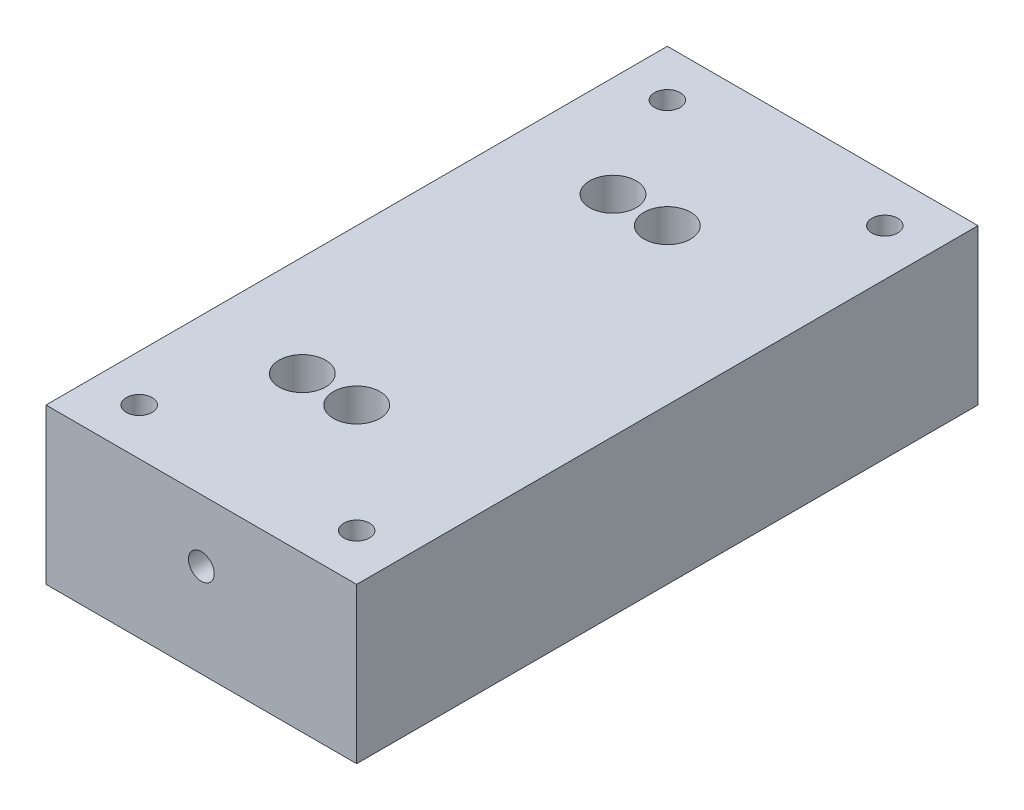
ISO-10303-21;
HEADER;
FILE_DESCRIPTION(('STEP AP214'),'2;1');
FILE_NAME('part.step','',(''),(''),'','','');
FILE_SCHEMA(('AUTOMOTIVE_DESIGN { 1 0 10303 214 1 1 1 1 }'));
ENDSEC;
DATA;
#1=APPLICATION_CONTEXT('core data for automotive mechanical design processes');
#2=APPLICATION_PROTOCOL_DEFINITION('international standard','automotive_design',2000,#1);
#3=PRODUCT_CONTEXT('',#1,'mechanical');
#4=PRODUCT('Part','Part','',(#3));
#5=PRODUCT_RELATED_PRODUCT_CATEGORY('part','',(#4));
#6=PRODUCT_DEFINITION_FORMATION('','',#4);
#7=PRODUCT_DEFINITION_CONTEXT('part definition',#1,'design');
#8=PRODUCT_DEFINITION('design','',#6,#7);
#9=PRODUCT_DEFINITION_SHAPE('','',#8);
#10=(LENGTH_UNIT() NAMED_UNIT(*) SI_UNIT(.MILLI.,.METRE.));
#11=(NAMED_UNIT(*) PLANE_ANGLE_UNIT() SI_UNIT($,.RADIAN.));
#12=(NAMED_UNIT(*) SI_UNIT($,.STERADIAN.) SOLID_ANGLE_UNIT());
#13=UNCERTAINTY_MEASURE_WITH_UNIT(LENGTH_MEASURE(1.E-05),#10,'distance_accuracy_value','');
#14=(GEOMETRIC_REPRESENTATION_CONTEXT(3) GLOBAL_UNCERTAINTY_ASSIGNED_CONTEXT((#13)) GLOBAL_UNIT_ASSIGNED_CONTEXT((#10,
#11,#12)) REPRESENTATION_CONTEXT('',''));
#15=CARTESIAN_POINT('',(0.,0.,0.));
#16=DIRECTION('',(0.,0.,1.));
#17=DIRECTION('',(1.,0.,0.));
#18=AXIS2_PLACEMENT_3D('',#15,#16,#17);
#19=CARTESIAN_POINT('',(50.,-25.,200.));
#20=DIRECTION('',(0.,-1.,0.));
#21=DIRECTION('',(1.,0.,0.));
#22=AXIS2_PLACEMENT_3D('',#19,#20,#21);
#23=PLANE('',#22);
#24=CARTESIAN_POINT('',(-17.5,-25.,50.));
#25=DIRECTION('',(0.,-1.,0.));
#26=DIRECTION('',(0.,0.,-1.));
#27=AXIS2_PLACEMENT_3D('',#24,#25,#26);
#28=CIRCLE('',#27,7.5);
#29=CARTESIAN_POINT('',(-17.5,-25.,42.5));
#30=VERTEX_POINT('',#29);
#31=EDGE_CURVE('E132',#30,#30,#28,.T.);
#32=ORIENTED_EDGE('',*,*,#31,.F.);
#33=EDGE_LOOP('',(#32));
#34=FACE_BOUND('',#33,.T.);
#35=CARTESIAN_POINT('',(-17.5,-25.,150.));
#36=DIRECTION('',(0.,-1.,0.));
#37=DIRECTION('',(0.,0.,-1.));
#38=AXIS2_PLACEMENT_3D('',#35,#36,#37);
#39=CIRCLE('',#38,7.5);
#40=CARTESIAN_POINT('',(-17.5,-25.,142.5));
#41=VERTEX_POINT('',#40);
#42=EDGE_CURVE('E150',#41,#41,#39,.T.);
#43=ORIENTED_EDGE('',*,*,#42,.F.);
#44=EDGE_LOOP('',(#43));
#45=FACE_BOUND('',#44,.T.);
#46=CARTESIAN_POINT('',(0.,-25.,50.));
#47=DIRECTION('',(0.,-1.,0.));
#48=DIRECTION('',(0.,0.,-1.));
#49=AXIS2_PLACEMENT_3D('',#46,#47,#48);
#50=CIRCLE('',#49,7.5);
#51=CARTESIAN_POINT('',(0.,-25.,42.5));
#52=VERTEX_POINT('',#51);
#53=EDGE_CURVE('E195',#52,#52,#50,.T.);
#54=ORIENTED_EDGE('',*,*,#53,.F.);
#55=EDGE_LOOP('',(#54));
#56=FACE_BOUND('',#55,.T.);
#57=CARTESIAN_POINT('',(0.,-25.,150.));
#58=DIRECTION('',(0.,-1.,0.));
#59=DIRECTION('',(0.,0.,-1.));
#60=AXIS2_PLACEMENT_3D('',#57,#58,#59);
#61=CIRCLE('',#60,7.5);
#62=CARTESIAN_POINT('',(0.,-25.,142.5));
#63=VERTEX_POINT('',#62);
#64=EDGE_CURVE('E213',#63,#63,#61,.T.);
#65=ORIENTED_EDGE('',*,*,#64,.F.);
#66=EDGE_LOOP('',(#65));
#67=FACE_BOUND('',#66,.T.);
#68=DIRECTION('',(-1.,0.,0.));
#69=VECTOR('',#68,1.);
#70=CARTESIAN_POINT('',(50.,-25.,0.));
#71=LINE('',#70,#69);
#72=CARTESIAN_POINT('',(50.,-25.,0.));
#73=VERTEX_POINT('',#72);
#74=CARTESIAN_POINT('',(-50.,-25.,0.));
#75=VERTEX_POINT('',#74);
#76=EDGE_CURVE('E231',#73,#75,#71,.T.);
#77=ORIENTED_EDGE('',*,*,#76,.F.);
#78=DIRECTION('',(0.,0.,-1.));
#79=VECTOR('',#78,1.);
#80=CARTESIAN_POINT('',(50.,-25.,200.));
#81=LINE('',#80,#79);
#82=CARTESIAN_POINT('',(50.,-25.,200.));
#83=VERTEX_POINT('',#82);
#84=EDGE_CURVE('E11',#83,#73,#81,.T.);
#85=ORIENTED_EDGE('',*,*,#84,.F.);
#86=DIRECTION('',(-1.,0.,0.));
#87=VECTOR('',#86,1.);
#88=CARTESIAN_POINT('',(50.,-25.,200.));
#89=LINE('',#88,#87);
#90=CARTESIAN_POINT('',(-50.,-25.,200.));
#91=VERTEX_POINT('',#90);
#92=EDGE_CURVE('E232',#83,#91,#89,.T.);
#93=ORIENTED_EDGE('',*,*,#92,.T.);
#94=DIRECTION('',(0.,0.,-1.));
#95=VECTOR('',#94,1.);
#96=CARTESIAN_POINT('',(-50.,-25.,200.));
#97=LINE('',#96,#95);
#98=EDGE_CURVE('E37',#91,#75,#97,.T.);
#99=ORIENTED_EDGE('',*,*,#98,.T.);
#100=EDGE_LOOP('',(#77,#85,#93,#99));
#101=FACE_BOUND('',#100,.T.);
#102=ADVANCED_FACE('F34',(#34,#45,#56,#67,#101),#23,.T.);
#103=CARTESIAN_POINT('',(50.,-25.,200.));
#104=DIRECTION('',(-1.,0.,0.));
#105=DIRECTION('',(0.,0.,1.));
#106=AXIS2_PLACEMENT_3D('',#103,#104,#105);
#107=PLANE('',#106);
#108=DIRECTION('',(0.,1.,0.));
#109=VECTOR('',#108,1.);
#110=CARTESIAN_POINT('',(50.,-25.,0.));
#111=LINE('',#110,#109);
#112=CARTESIAN_POINT('',(50.,25.,0.));
#113=VERTEX_POINT('',#112);
#114=EDGE_CURVE('E68',#73,#113,#111,.T.);
#115=ORIENTED_EDGE('',*,*,#114,.T.);
#116=DIRECTION('',(0.,0.,-1.));
#117=VECTOR('',#116,1.);
#118=CARTESIAN_POINT('',(50.,25.,200.));
#119=LINE('',#118,#117);
#120=CARTESIAN_POINT('',(50.,25.,200.));
#121=VERTEX_POINT('',#120);
#122=EDGE_CURVE('E43',#121,#113,#119,.T.);
#123=ORIENTED_EDGE('',*,*,#122,.F.);
#124=DIRECTION('',(0.,1.,0.));
#125=VECTOR('',#124,1.);
#126=CARTESIAN_POINT('',(50.,-25.,200.));
#127=LINE('',#126,#125);
#128=EDGE_CURVE('E238',#83,#121,#127,.T.);
#129=ORIENTED_EDGE('',*,*,#128,.F.);
#130=ORIENTED_EDGE('',*,*,#84,.T.);
#131=EDGE_LOOP('',(#115,#123,#129,#130));
#132=FACE_BOUND('',#131,.T.);
#133=ADVANCED_FACE('F259',(#132),#107,.F.);
#134=CARTESIAN_POINT('',(50.,25.,200.));
#135=DIRECTION('',(0.,-1.,0.));
#136=DIRECTION('',(1.,0.,0.));
#137=AXIS2_PLACEMENT_3D('',#134,#135,#136);
#138=PLANE('',#137);
#139=CARTESIAN_POINT('',(-17.5,25.,150.));
#140=DIRECTION('',(0.,1.,0.));
#141=DIRECTION('',(0.,0.,1.));
#142=AXIS2_PLACEMENT_3D('',#139,#140,#141);
#143=CIRCLE('',#142,7.50000000000002);
#144=CARTESIAN_POINT('',(-17.5,25.,157.5));
#145=VERTEX_POINT('',#144);
#146=EDGE_CURVE('E123',#145,#145,#143,.T.);
#147=ORIENTED_EDGE('',*,*,#146,.F.);
#148=EDGE_LOOP('',(#147));
#149=FACE_BOUND('',#148,.T.);
#150=CARTESIAN_POINT('',(-17.5,25.,50.));
#151=DIRECTION('',(0.,1.,0.));
#152=DIRECTION('',(0.,0.,1.));
#153=AXIS2_PLACEMENT_3D('',#150,#151,#152);
#154=CIRCLE('',#153,7.50000000000002);
#155=CARTESIAN_POINT('',(-17.5,25.,57.5));
#156=VERTEX_POINT('',#155);
#157=EDGE_CURVE('E141',#156,#156,#154,.T.);
#158=ORIENTED_EDGE('',*,*,#157,.F.);
#159=EDGE_LOOP('',(#158));
#160=FACE_BOUND('',#159,.T.);
#161=CARTESIAN_POINT('',(-35.,25.,15.));
#162=DIRECTION('',(0.,1.,0.));
#163=DIRECTION('',(0.,0.,1.));
#164=AXIS2_PLACEMENT_3D('',#161,#162,#163);
#165=CIRCLE('',#164,4.15);
#166=CARTESIAN_POINT('',(-35.,25.,19.15));
#167=VERTEX_POINT('',#166);
#168=EDGE_CURVE('E171',#167,#167,#165,.T.);
#169=ORIENTED_EDGE('',*,*,#168,.F.);
#170=EDGE_LOOP('',(#169));
#171=FACE_BOUND('',#170,.T.);
#172=CARTESIAN_POINT('',(35.,25.,15.));
#173=DIRECTION('',(0.,1.,0.));
#174=DIRECTION('',(0.,0.,1.));
#175=AXIS2_PLACEMENT_3D('',#172,#173,#174);
#176=CIRCLE('',#175,4.14999999999999);
#177=CARTESIAN_POINT('',(35.,25.,19.15));
#178=VERTEX_POINT('',#177);
#179=EDGE_CURVE('E177',#178,#178,#176,.T.);
#180=ORIENTED_EDGE('',*,*,#179,.F.);
#181=EDGE_LOOP('',(#180));
#182=FACE_BOUND('',#181,.T.);
#183=CARTESIAN_POINT('',(35.,25.,185.));
#184=DIRECTION('',(0.,1.,0.));
#185=DIRECTION('',(0.,0.,1.));
#186=AXIS2_PLACEMENT_3D('',#183,#184,#185);
#187=CIRCLE('',#186,4.14999999999999);
#188=CARTESIAN_POINT('',(35.,25.,189.15));
#189=VERTEX_POINT('',#188);
#190=EDGE_CURVE('E183',#189,#189,#187,.T.);
#191=ORIENTED_EDGE('',*,*,#190,.F.);
#192=EDGE_LOOP('',(#191));
#193=FACE_BOUND('',#192,.T.);
#194=CARTESIAN_POINT('',(-35.,25.,185.));
#195=DIRECTION('',(0.,1.,0.));
#196=DIRECTION('',(0.,0.,1.));
#197=AXIS2_PLACEMENT_3D('',#194,#195,#196);
#198=CIRCLE('',#197,4.15);
#199=CARTESIAN_POINT('',(-35.,25.,189.15));
#200=VERTEX_POINT('',#199);
#201=EDGE_CURVE('E189',#200,#200,#198,.T.);
#202=ORIENTED_EDGE('',*,*,#201,.F.);
#203=EDGE_LOOP('',(#202));
#204=FACE_BOUND('',#203,.T.);
#205=CARTESIAN_POINT('',(0.,25.,50.));
#206=DIRECTION('',(0.,1.,0.));
#207=DIRECTION('',(0.,0.,1.));
#208=AXIS2_PLACEMENT_3D('',#205,#206,#207);
#209=CIRCLE('',#208,7.50000000000002);
#210=CARTESIAN_POINT('',(0.,25.,57.5));
#211=VERTEX_POINT('',#210);
#212=EDGE_CURVE('E204',#211,#211,#209,.T.);
#213=ORIENTED_EDGE('',*,*,#212,.F.);
#214=EDGE_LOOP('',(#213));
#215=FACE_BOUND('',#214,.T.);
#216=CARTESIAN_POINT('',(0.,25.,150.));
#217=DIRECTION('',(0.,1.,0.));
#218=DIRECTION('',(0.,0.,1.));
#219=AXIS2_PLACEMENT_3D('',#216,#217,#218);
#220=CIRCLE('',#219,7.50000000000002);
#221=CARTESIAN_POINT('',(0.,25.,157.5));
#222=VERTEX_POINT('',#221);
#223=EDGE_CURVE('E222',#222,#222,#220,.T.);
#224=ORIENTED_EDGE('',*,*,#223,.F.);
#225=EDGE_LOOP('',(#224));
#226=FACE_BOUND('',#225,.T.);
#227=DIRECTION('',(-1.,0.,0.));
#228=VECTOR('',#227,1.);
#229=CARTESIAN_POINT('',(50.,25.,0.));
#230=LINE('',#229,#228);
#231=CARTESIAN_POINT('',(-50.,25.,0.));
#232=VERTEX_POINT('',#231);
#233=EDGE_CURVE('E245',#113,#232,#230,.T.);
#234=ORIENTED_EDGE('',*,*,#233,.T.);
#235=DIRECTION('',(0.,0.,-1.));
#236=VECTOR('',#235,1.);
#237=CARTESIAN_POINT('',(-50.,25.,200.));
#238=LINE('',#237,#236);
#239=CARTESIAN_POINT('',(-50.,25.,200.));
#240=VERTEX_POINT('',#239);
#241=EDGE_CURVE('E249',#240,#232,#238,.T.);
#242=ORIENTED_EDGE('',*,*,#241,.F.);
#243=DIRECTION('',(-1.,0.,0.));
#244=VECTOR('',#243,1.);
#245=CARTESIAN_POINT('',(50.,25.,200.));
#246=LINE('',#245,#244);
#247=EDGE_CURVE('E236',#121,#240,#246,.T.);
#248=ORIENTED_EDGE('',*,*,#247,.F.);
#249=ORIENTED_EDGE('',*,*,#122,.T.);
#250=EDGE_LOOP('',(#234,#242,#248,#249));
#251=FACE_BOUND('',#250,.T.);
#252=ADVANCED_FACE('F257',(#149,#160,#171,#182,#193,#204,#215,#226,#251),#138,.F.);
#253=CARTESIAN_POINT('',(-50.,-25.,200.));
#254=DIRECTION('',(-1.,0.,0.));
#255=DIRECTION('',(0.,0.,1.));
#256=AXIS2_PLACEMENT_3D('',#253,#254,#255);
#257=PLANE('',#256);
#258=CARTESIAN_POINT('',(-50.,7.5,165.));
#259=DIRECTION('',(-1.,0.,0.));
#260=DIRECTION('',(0.,0.,1.));
#261=AXIS2_PLACEMENT_3D('',#258,#259,#260);
#262=CIRCLE('',#261,4.14999999999999);
#263=CARTESIAN_POINT('',(-50.,7.5,169.15));
#264=VERTEX_POINT('',#263);
#265=EDGE_CURVE('E159',#264,#264,#262,.T.);
#266=ORIENTED_EDGE('',*,*,#265,.F.);
#267=EDGE_LOOP('',(#266));
#268=FACE_BOUND('',#267,.T.);
#269=CARTESIAN_POINT('',(-50.,7.5,35.));
#270=DIRECTION('',(-1.,0.,0.));
#271=DIRECTION('',(0.,0.,1.));
#272=AXIS2_PLACEMENT_3D('',#269,#270,#271);
#273=CIRCLE('',#272,4.14999999999999);
#274=CARTESIAN_POINT('',(-50.,7.5,39.15));
#275=VERTEX_POINT('',#274);
#276=EDGE_CURVE('E165',#275,#275,#273,.T.);
#277=ORIENTED_EDGE('',*,*,#276,.F.);
#278=EDGE_LOOP('',(#277));
#279=FACE_BOUND('',#278,.T.);
#280=DIRECTION('',(0.,1.,0.));
#281=VECTOR('',#280,1.);
#282=CARTESIAN_POINT('',(-50.,-25.,0.));
#283=LINE('',#282,#281);
#284=EDGE_CURVE('E242',#75,#232,#283,.T.);
#285=ORIENTED_EDGE('',*,*,#284,.F.);
#286=ORIENTED_EDGE('',*,*,#98,.F.);
#287=DIRECTION('',(0.,1.,0.));
#288=VECTOR('',#287,1.);
#289=CARTESIAN_POINT('',(-50.,-25.,200.));
#290=LINE('',#289,#288);
#291=EDGE_CURVE('E234',#91,#240,#290,.T.);
#292=ORIENTED_EDGE('',*,*,#291,.T.);
#293=ORIENTED_EDGE('',*,*,#241,.T.);
#294=EDGE_LOOP('',(#285,#286,#292,#293));
#295=FACE_BOUND('',#294,.T.);
#296=ADVANCED_FACE('F252',(#268,#279,#295),#257,.T.);
#297=CARTESIAN_POINT('',(0.,0.,200.));
#298=DIRECTION('',(0.,0.,-1.));
#299=DIRECTION('',(-1.,0.,0.));
#300=AXIS2_PLACEMENT_3D('',#297,#298,#299);
#301=PLANE('',#300);
#302=CARTESIAN_POINT('',(4.44444443054026E-06,5.00000000000008,200.));
#303=DIRECTION('',(0.,0.,1.));
#304=DIRECTION('',(1.,0.,0.));
#305=AXIS2_PLACEMENT_3D('',#302,#303,#304);
#306=CIRCLE('',#305,4.14999999999999);
#307=CARTESIAN_POINT('',(4.15000444444442,5.00000000000008,200.));
#308=VERTEX_POINT('',#307);
#309=EDGE_CURVE('E112',#308,#308,#306,.T.);
#310=ORIENTED_EDGE('',*,*,#309,.F.);
#311=EDGE_LOOP('',(#310));
#312=FACE_BOUND('',#311,.T.);
#313=ORIENTED_EDGE('',*,*,#92,.F.);
#314=ORIENTED_EDGE('',*,*,#128,.T.);
#315=ORIENTED_EDGE('',*,*,#247,.T.);
#316=ORIENTED_EDGE('',*,*,#291,.F.);
#317=EDGE_LOOP('',(#313,#314,#315,#316));
#318=FACE_BOUND('',#317,.T.);
#319=ADVANCED_FACE('F261',(#312,#318),#301,.F.);
#320=CARTESIAN_POINT('',(0.,0.,0.));
#321=DIRECTION('',(0.,0.,-1.));
#322=DIRECTION('',(-1.,0.,0.));
#323=AXIS2_PLACEMENT_3D('',#320,#321,#322);
#324=PLANE('',#323);
#325=CARTESIAN_POINT('',(-17.5347222222223,-4.99999999999996,0.));
#326=DIRECTION('',(0.,0.,-1.));
#327=DIRECTION('',(-1.,0.,0.));
#328=AXIS2_PLACEMENT_3D('',#325,#326,#327);
#329=CIRCLE('',#328,4.14999999999999);
#330=CARTESIAN_POINT('',(-21.6847222222223,-4.99999999999996,0.));
#331=VERTEX_POINT('',#330);
#332=EDGE_CURVE('E113',#331,#331,#329,.T.);
#333=ORIENTED_EDGE('',*,*,#332,.F.);
#334=EDGE_LOOP('',(#333));
#335=FACE_BOUND('',#334,.T.);
#336=ORIENTED_EDGE('',*,*,#76,.T.);
#337=ORIENTED_EDGE('',*,*,#284,.T.);
#338=ORIENTED_EDGE('',*,*,#233,.F.);
#339=ORIENTED_EDGE('',*,*,#114,.F.);
#340=EDGE_LOOP('',(#336,#337,#338,#339));
#341=FACE_BOUND('',#340,.T.);
#342=ADVANCED_FACE('F255',(#335,#341),#324,.T.);
#343=CARTESIAN_POINT('',(0.,25.,150.));
#344=DIRECTION('',(0.,1.,0.));
#345=DIRECTION('',(0.,0.,1.));
#346=AXIS2_PLACEMENT_3D('',#343,#344,#345);
#347=CYLINDRICAL_SURFACE('',#346,4.49999999999999);
#348=CARTESIAN_POINT('',(0.,-18.5,150.));
#349=DIRECTION('',(0.,-1.,0.));
#350=DIRECTION('',(0.,0.,-1.));
#351=AXIS2_PLACEMENT_3D('',#348,#349,#350);
#352=CIRCLE('',#351,4.50000000000001);
#353=CARTESIAN_POINT('',(0.,-18.5,145.5));
#354=VERTEX_POINT('',#353);
#355=EDGE_CURVE('E219',#354,#354,#352,.T.);
#356=ORIENTED_EDGE('',*,*,#355,.T.);
#357=EDGE_LOOP('',(#356));
#358=FACE_BOUND('',#357,.T.);
#359=CARTESIAN_POINT('',(0.,-9.49999999999999,150.));
#360=DIRECTION('',(0.,1.,0.));
#361=DIRECTION('',(0.,0.,1.));
#362=AXIS2_PLACEMENT_3D('',#359,#360,#361);
#363=CIRCLE('',#362,4.49999999999999);
#364=CARTESIAN_POINT('',(0.,-9.49999999999999,154.5));
#365=VERTEX_POINT('',#364);
#366=EDGE_CURVE('E228',#365,#365,#363,.T.);
#367=ORIENTED_EDGE('',*,*,#366,.T.);
#368=EDGE_LOOP('',(#367));
#369=FACE_BOUND('',#368,.T.);
#370=ADVANCED_FACE('F270',(#358,#369),#347,.F.);
#371=CARTESIAN_POINT('',(4.49999999999999,-9.49999999999999,150.));
#372=DIRECTION('',(0.,-1.,0.));
#373=DIRECTION('',(0.,0.,-1.));
#374=AXIS2_PLACEMENT_3D('',#371,#372,#373);
#375=PLANE('',#374);
#376=ORIENTED_EDGE('',*,*,#366,.F.);
#377=EDGE_LOOP('',(#376));
#378=FACE_BOUND('',#377,.T.);
#379=CARTESIAN_POINT('',(0.,-9.49999999999999,150.));
#380=DIRECTION('',(0.,1.,0.));
#381=DIRECTION('',(0.,0.,1.));
#382=AXIS2_PLACEMENT_3D('',#379,#380,#381);
#383=CIRCLE('',#382,7.49999999999999);
#384=CARTESIAN_POINT('',(0.,-9.49999999999999,157.5));
#385=VERTEX_POINT('',#384);
#386=EDGE_CURVE('E225',#385,#385,#383,.T.);
#387=ORIENTED_EDGE('',*,*,#386,.T.);
#388=EDGE_LOOP('',(#387));
#389=FACE_BOUND('',#388,.T.);
#390=ADVANCED_FACE('F314',(#378,#389),#375,.F.);
#391=CARTESIAN_POINT('',(0.,25.,150.));
#392=DIRECTION('',(0.,1.,0.));
#393=DIRECTION('',(0.,0.,1.));
#394=AXIS2_PLACEMENT_3D('',#391,#392,#393);
#395=CYLINDRICAL_SURFACE('',#394,7.50000000000001);
#396=ORIENTED_EDGE('',*,*,#386,.F.);
#397=EDGE_LOOP('',(#396));
#398=FACE_BOUND('',#397,.T.);
#399=ORIENTED_EDGE('',*,*,#223,.T.);
#400=EDGE_LOOP('',(#399));
#401=FACE_BOUND('',#400,.T.);
#402=ADVANCED_FACE('F306',(#398,#401),#395,.F.);
#403=CARTESIAN_POINT('',(4.50000000000001,-18.5,150.));
#404=DIRECTION('',(0.,1.,0.));
#405=DIRECTION('',(0.,0.,1.));
#406=AXIS2_PLACEMENT_3D('',#403,#404,#405);
#407=PLANE('',#406);
#408=ORIENTED_EDGE('',*,*,#355,.F.);
#409=EDGE_LOOP('',(#408));
#410=FACE_BOUND('',#409,.T.);
#411=CARTESIAN_POINT('',(0.,-18.5,150.));
#412=DIRECTION('',(0.,-1.,0.));
#413=DIRECTION('',(0.,0.,-1.));
#414=AXIS2_PLACEMENT_3D('',#411,#412,#413);
#415=CIRCLE('',#414,7.49999999999999);
#416=CARTESIAN_POINT('',(0.,-18.5,142.5));
#417=VERTEX_POINT('',#416);
#418=EDGE_CURVE('E216',#417,#417,#415,.T.);
#419=ORIENTED_EDGE('',*,*,#418,.T.);
#420=EDGE_LOOP('',(#419));
#421=FACE_BOUND('',#420,.T.);
#422=ADVANCED_FACE('F296',(#410,#421),#407,.F.);
#423=CARTESIAN_POINT('',(0.,-25.,150.));
#424=DIRECTION('',(0.,-1.,0.));
#425=DIRECTION('',(0.,0.,-1.));
#426=AXIS2_PLACEMENT_3D('',#423,#424,#425);
#427=CYLINDRICAL_SURFACE('',#426,7.49999999999999);
#428=ORIENTED_EDGE('',*,*,#418,.F.);
#429=EDGE_LOOP('',(#428));
#430=FACE_BOUND('',#429,.T.);
#431=ORIENTED_EDGE('',*,*,#64,.T.);
#432=EDGE_LOOP('',(#431));
#433=FACE_BOUND('',#432,.T.);
#434=ADVANCED_FACE('F293',(#430,#433),#427,.F.);
#435=CARTESIAN_POINT('',(0.,25.,50.));
#436=DIRECTION('',(0.,1.,0.));
#437=DIRECTION('',(0.,0.,1.));
#438=AXIS2_PLACEMENT_3D('',#435,#436,#437);
#439=CYLINDRICAL_SURFACE('',#438,4.49999999999999);
#440=CARTESIAN_POINT('',(0.,-18.5,50.));
#441=DIRECTION('',(0.,-1.,0.));
#442=DIRECTION('',(0.,0.,-1.));
#443=AXIS2_PLACEMENT_3D('',#440,#441,#442);
#444=CIRCLE('',#443,4.50000000000001);
#445=CARTESIAN_POINT('',(0.,-18.5,45.5));
#446=VERTEX_POINT('',#445);
#447=EDGE_CURVE('E201',#446,#446,#444,.T.);
#448=ORIENTED_EDGE('',*,*,#447,.T.);
#449=EDGE_LOOP('',(#448));
#450=FACE_BOUND('',#449,.T.);
#451=CARTESIAN_POINT('',(0.,-9.49999999999999,50.));
#452=DIRECTION('',(0.,1.,0.));
#453=DIRECTION('',(0.,0.,1.));
#454=AXIS2_PLACEMENT_3D('',#451,#452,#453);
#455=CIRCLE('',#454,4.49999999999999);
#456=CARTESIAN_POINT('',(0.,-9.49999999999999,54.5));
#457=VERTEX_POINT('',#456);
#458=EDGE_CURVE('E210',#457,#457,#455,.T.);
#459=ORIENTED_EDGE('',*,*,#458,.T.);
#460=EDGE_LOOP('',(#459));
#461=FACE_BOUND('',#460,.T.);
#462=ADVANCED_FACE('F295',(#450,#461),#439,.F.);
#463=CARTESIAN_POINT('',(4.49999999999999,-9.49999999999999,50.));
#464=DIRECTION('',(0.,-1.,0.));
#465=DIRECTION('',(0.,0.,-1.));
#466=AXIS2_PLACEMENT_3D('',#463,#464,#465);
#467=PLANE('',#466);
#468=ORIENTED_EDGE('',*,*,#458,.F.);
#469=EDGE_LOOP('',(#468));
#470=FACE_BOUND('',#469,.T.);
#471=CARTESIAN_POINT('',(0.,-9.49999999999999,50.));
#472=DIRECTION('',(0.,1.,0.));
#473=DIRECTION('',(0.,0.,1.));
#474=AXIS2_PLACEMENT_3D('',#471,#472,#473);
#475=CIRCLE('',#474,7.49999999999999);
#476=CARTESIAN_POINT('',(0.,-9.49999999999999,57.5));
#477=VERTEX_POINT('',#476);
#478=EDGE_CURVE('E207',#477,#477,#475,.T.);
#479=ORIENTED_EDGE('',*,*,#478,.T.);
#480=EDGE_LOOP('',(#479));
#481=FACE_BOUND('',#480,.T.);
#482=ADVANCED_FACE('F303',(#470,#481),#467,.F.);
#483=CARTESIAN_POINT('',(0.,25.,50.));
#484=DIRECTION('',(0.,1.,0.));
#485=DIRECTION('',(0.,0.,1.));
#486=AXIS2_PLACEMENT_3D('',#483,#484,#485);
#487=CYLINDRICAL_SURFACE('',#486,7.50000000000001);
#488=ORIENTED_EDGE('',*,*,#478,.F.);
#489=EDGE_LOOP('',(#488));
#490=FACE_BOUND('',#489,.T.);
#491=ORIENTED_EDGE('',*,*,#212,.T.);
#492=EDGE_LOOP('',(#491));
#493=FACE_BOUND('',#492,.T.);
#494=ADVANCED_FACE('F350',(#490,#493),#487,.F.);
#495=CARTESIAN_POINT('',(4.50000000000001,-18.5,50.));
#496=DIRECTION('',(0.,1.,0.));
#497=DIRECTION('',(0.,0.,1.));
#498=AXIS2_PLACEMENT_3D('',#495,#496,#497);
#499=PLANE('',#498);
#500=ORIENTED_EDGE('',*,*,#447,.F.);
#501=EDGE_LOOP('',(#500));
#502=FACE_BOUND('',#501,.T.);
#503=CARTESIAN_POINT('',(0.,-18.5,50.));
#504=DIRECTION('',(0.,-1.,0.));
#505=DIRECTION('',(0.,0.,-1.));
#506=AXIS2_PLACEMENT_3D('',#503,#504,#505);
#507=CIRCLE('',#506,7.49999999999999);
#508=CARTESIAN_POINT('',(0.,-18.5,42.5));
#509=VERTEX_POINT('',#508);
#510=EDGE_CURVE('E198',#509,#509,#507,.T.);
#511=ORIENTED_EDGE('',*,*,#510,.T.);
#512=EDGE_LOOP('',(#511));
#513=FACE_BOUND('',#512,.T.);
#514=ADVANCED_FACE('F352',(#502,#513),#499,.F.);
#515=CARTESIAN_POINT('',(0.,-25.,50.));
#516=DIRECTION('',(0.,-1.,0.));
#517=DIRECTION('',(0.,0.,-1.));
#518=AXIS2_PLACEMENT_3D('',#515,#516,#517);
#519=CYLINDRICAL_SURFACE('',#518,7.49999999999999);
#520=ORIENTED_EDGE('',*,*,#510,.F.);
#521=EDGE_LOOP('',(#520));
#522=FACE_BOUND('',#521,.T.);
#523=ORIENTED_EDGE('',*,*,#53,.T.);
#524=EDGE_LOOP('',(#523));
#525=FACE_BOUND('',#524,.T.);
#526=ADVANCED_FACE('F359',(#522,#525),#519,.F.);
#527=CARTESIAN_POINT('',(-35.,-4.99999999999999,185.));
#528=DIRECTION('',(0.,1.,0.));
#529=DIRECTION('',(0.,0.,1.));
#530=AXIS2_PLACEMENT_3D('',#527,#528,#529);
#531=CONICAL_SURFACE('',#530,4.14999999999999,1.02974425867665);
#532=CARTESIAN_POINT('',(-35.,-7.49357156896436,185.));
#533=VERTEX_POINT('',#532);
#534=VERTEX_LOOP('',#533);
#535=FACE_BOUND('',#534,.T.);
#536=CARTESIAN_POINT('',(-35.,-4.99999999999999,185.));
#537=DIRECTION('',(0.,1.,0.));
#538=DIRECTION('',(0.,0.,1.));
#539=AXIS2_PLACEMENT_3D('',#536,#537,#538);
#540=CIRCLE('',#539,4.14999999999999);
#541=CARTESIAN_POINT('',(-35.,-4.99999999999999,189.15));
#542=VERTEX_POINT('',#541);
#543=EDGE_CURVE('E192',#542,#542,#540,.T.);
#544=ORIENTED_EDGE('',*,*,#543,.T.);
#545=EDGE_LOOP('',(#544));
#546=FACE_BOUND('',#545,.T.);
#547=ADVANCED_FACE('F367',(#535,#546),#531,.F.);
#548=CARTESIAN_POINT('',(-35.,25.,185.));
#549=DIRECTION('',(0.,1.,0.));
#550=DIRECTION('',(0.,0.,1.));
#551=AXIS2_PLACEMENT_3D('',#548,#549,#550);
#552=CYLINDRICAL_SURFACE('',#551,4.15);
#553=ORIENTED_EDGE('',*,*,#543,.F.);
#554=EDGE_LOOP('',(#553));
#555=FACE_BOUND('',#554,.T.);
#556=ORIENTED_EDGE('',*,*,#201,.T.);
#557=EDGE_LOOP('',(#556));
#558=FACE_BOUND('',#557,.T.);
#559=ADVANCED_FACE('F371',(#555,#558),#552,.F.);
#560=CARTESIAN_POINT('',(35.,-4.99999999999999,185.));
#561=DIRECTION('',(0.,1.,0.));
#562=DIRECTION('',(0.,0.,1.));
#563=AXIS2_PLACEMENT_3D('',#560,#561,#562);
#564=CONICAL_SURFACE('',#563,4.14999999999999,1.02974425867665);
#565=CARTESIAN_POINT('',(35.,-7.49357156896436,185.));
#566=VERTEX_POINT('',#565);
#567=VERTEX_LOOP('',#566);
#568=FACE_BOUND('',#567,.T.);
#569=CARTESIAN_POINT('',(35.,-4.99999999999999,185.));
#570=DIRECTION('',(0.,1.,0.));
#571=DIRECTION('',(0.,0.,1.));
#572=AXIS2_PLACEMENT_3D('',#569,#570,#571);
#573=CIRCLE('',#572,4.14999999999999);
#574=CARTESIAN_POINT('',(35.,-4.99999999999999,189.15));
#575=VERTEX_POINT('',#574);
#576=EDGE_CURVE('E186',#575,#575,#573,.T.);
#577=ORIENTED_EDGE('',*,*,#576,.T.);
#578=EDGE_LOOP('',(#577));
#579=FACE_BOUND('',#578,.T.);
#580=ADVANCED_FACE('F375',(#568,#579),#564,.F.);
#581=CARTESIAN_POINT('',(35.,25.,185.));
#582=DIRECTION('',(0.,1.,0.));
#583=DIRECTION('',(0.,0.,1.));
#584=AXIS2_PLACEMENT_3D('',#581,#582,#583);
#585=CYLINDRICAL_SURFACE('',#584,4.14999999999999);
#586=ORIENTED_EDGE('',*,*,#576,.F.);
#587=EDGE_LOOP('',(#586));
#588=FACE_BOUND('',#587,.T.);
#589=ORIENTED_EDGE('',*,*,#190,.T.);
#590=EDGE_LOOP('',(#589));
#591=FACE_BOUND('',#590,.T.);
#592=ADVANCED_FACE('F379',(#588,#591),#585,.F.);
#593=CARTESIAN_POINT('',(35.,-4.99999999999999,15.));
#594=DIRECTION('',(0.,1.,0.));
#595=DIRECTION('',(0.,0.,1.));
#596=AXIS2_PLACEMENT_3D('',#593,#594,#595);
#597=CONICAL_SURFACE('',#596,4.14999999999999,1.02974425867665);
#598=CARTESIAN_POINT('',(35.,-7.49357156896436,15.));
#599=VERTEX_POINT('',#598);
#600=VERTEX_LOOP('',#599);
#601=FACE_BOUND('',#600,.T.);
#602=CARTESIAN_POINT('',(35.,-4.99999999999999,15.));
#603=DIRECTION('',(0.,1.,0.));
#604=DIRECTION('',(0.,0.,1.));
#605=AXIS2_PLACEMENT_3D('',#602,#603,#604);
#606=CIRCLE('',#605,4.14999999999999);
#607=CARTESIAN_POINT('',(35.,-4.99999999999999,19.15));
#608=VERTEX_POINT('',#607);
#609=EDGE_CURVE('E180',#608,#608,#606,.T.);
#610=ORIENTED_EDGE('',*,*,#609,.T.);
#611=EDGE_LOOP('',(#610));
#612=FACE_BOUND('',#611,.T.);
#613=ADVANCED_FACE('F383',(#601,#612),#597,.F.);
#614=CARTESIAN_POINT('',(35.,25.,15.));
#615=DIRECTION('',(0.,1.,0.));
#616=DIRECTION('',(0.,0.,1.));
#617=AXIS2_PLACEMENT_3D('',#614,#615,#616);
#618=CYLINDRICAL_SURFACE('',#617,4.14999999999999);
#619=ORIENTED_EDGE('',*,*,#609,.F.);
#620=EDGE_LOOP('',(#619));
#621=FACE_BOUND('',#620,.T.);
#622=ORIENTED_EDGE('',*,*,#179,.T.);
#623=EDGE_LOOP('',(#622));
#624=FACE_BOUND('',#623,.T.);
#625=ADVANCED_FACE('F387',(#621,#624),#618,.F.);
#626=CARTESIAN_POINT('',(-35.,-4.99999999999999,15.));
#627=DIRECTION('',(0.,1.,0.));
#628=DIRECTION('',(0.,0.,1.));
#629=AXIS2_PLACEMENT_3D('',#626,#627,#628);
#630=CONICAL_SURFACE('',#629,4.14999999999999,1.02974425867665);
#631=CARTESIAN_POINT('',(-35.,-7.49357156896436,15.));
#632=VERTEX_POINT('',#631);
#633=VERTEX_LOOP('',#632);
#634=FACE_BOUND('',#633,.T.);
#635=CARTESIAN_POINT('',(-35.,-4.99999999999999,15.));
#636=DIRECTION('',(0.,1.,0.));
#637=DIRECTION('',(0.,0.,1.));
#638=AXIS2_PLACEMENT_3D('',#635,#636,#637);
#639=CIRCLE('',#638,4.14999999999999);
#640=CARTESIAN_POINT('',(-35.,-4.99999999999999,19.15));
#641=VERTEX_POINT('',#640);
#642=EDGE_CURVE('E174',#641,#641,#639,.T.);
#643=ORIENTED_EDGE('',*,*,#642,.T.);
#644=EDGE_LOOP('',(#643));
#645=FACE_BOUND('',#644,.T.);
#646=ADVANCED_FACE('F391',(#634,#645),#630,.F.);
#647=CARTESIAN_POINT('',(-35.,25.,15.));
#648=DIRECTION('',(0.,1.,0.));
#649=DIRECTION('',(0.,0.,1.));
#650=AXIS2_PLACEMENT_3D('',#647,#648,#649);
#651=CYLINDRICAL_SURFACE('',#650,4.15);
#652=ORIENTED_EDGE('',*,*,#642,.F.);
#653=EDGE_LOOP('',(#652));
#654=FACE_BOUND('',#653,.T.);
#655=ORIENTED_EDGE('',*,*,#168,.T.);
#656=EDGE_LOOP('',(#655));
#657=FACE_BOUND('',#656,.T.);
#658=ADVANCED_FACE('F395',(#654,#657),#651,.F.);
#659=CARTESIAN_POINT('',(-20.,7.5,35.));
#660=DIRECTION('',(-1.,0.,0.));
#661=DIRECTION('',(0.,0.,1.));
#662=AXIS2_PLACEMENT_3D('',#659,#660,#661);
#663=CONICAL_SURFACE('',#662,4.14999999999999,1.02974425867665);
#664=CARTESIAN_POINT('',(-17.5064284310356,7.49999999999999,35.));
#665=VERTEX_POINT('',#664);
#666=VERTEX_LOOP('',#665);
#667=FACE_BOUND('',#666,.T.);
#668=CARTESIAN_POINT('',(-20.,7.5,35.));
#669=DIRECTION('',(-1.,0.,0.));
#670=DIRECTION('',(0.,0.,1.));
#671=AXIS2_PLACEMENT_3D('',#668,#669,#670);
#672=CIRCLE('',#671,4.14999999999999);
#673=CARTESIAN_POINT('',(-20.,7.5,39.15));
#674=VERTEX_POINT('',#673);
#675=EDGE_CURVE('E168',#674,#674,#672,.T.);
#676=ORIENTED_EDGE('',*,*,#675,.T.);
#677=EDGE_LOOP('',(#676));
#678=FACE_BOUND('',#677,.T.);
#679=ADVANCED_FACE('F399',(#667,#678),#663,.F.);
#680=CARTESIAN_POINT('',(-50.,7.5,35.));
#681=DIRECTION('',(-1.,0.,0.));
#682=DIRECTION('',(0.,0.,1.));
#683=AXIS2_PLACEMENT_3D('',#680,#681,#682);
#684=CYLINDRICAL_SURFACE('',#683,4.14999999999999);
#685=ORIENTED_EDGE('',*,*,#675,.F.);
#686=EDGE_LOOP('',(#685));
#687=FACE_BOUND('',#686,.T.);
#688=ORIENTED_EDGE('',*,*,#276,.T.);
#689=EDGE_LOOP('',(#688));
#690=FACE_BOUND('',#689,.T.);
#691=ADVANCED_FACE('F403',(#687,#690),#684,.F.);
#692=CARTESIAN_POINT('',(-20.,7.5,165.));
#693=DIRECTION('',(-1.,0.,0.));
#694=DIRECTION('',(0.,0.,1.));
#695=AXIS2_PLACEMENT_3D('',#692,#693,#694);
#696=CONICAL_SURFACE('',#695,4.14999999999999,1.02974425867665);
#697=CARTESIAN_POINT('',(-17.5064284310356,7.49999999999999,165.));
#698=VERTEX_POINT('',#697);
#699=VERTEX_LOOP('',#698);
#700=FACE_BOUND('',#699,.T.);
#701=CARTESIAN_POINT('',(-20.,7.5,165.));
#702=DIRECTION('',(-1.,0.,0.));
#703=DIRECTION('',(0.,0.,1.));
#704=AXIS2_PLACEMENT_3D('',#701,#702,#703);
#705=CIRCLE('',#704,4.14999999999999);
#706=CARTESIAN_POINT('',(-20.,7.5,169.15));
#707=VERTEX_POINT('',#706);
#708=EDGE_CURVE('E162',#707,#707,#705,.T.);
#709=ORIENTED_EDGE('',*,*,#708,.T.);
#710=EDGE_LOOP('',(#709));
#711=FACE_BOUND('',#710,.T.);
#712=ADVANCED_FACE('F407',(#700,#711),#696,.F.);
#713=CARTESIAN_POINT('',(-50.,7.5,165.));
#714=DIRECTION('',(-1.,0.,0.));
#715=DIRECTION('',(0.,0.,1.));
#716=AXIS2_PLACEMENT_3D('',#713,#714,#715);
#717=CYLINDRICAL_SURFACE('',#716,4.14999999999999);
#718=ORIENTED_EDGE('',*,*,#708,.F.);
#719=EDGE_LOOP('',(#718));
#720=FACE_BOUND('',#719,.T.);
#721=ORIENTED_EDGE('',*,*,#265,.T.);
#722=EDGE_LOOP('',(#721));
#723=FACE_BOUND('',#722,.T.);
#724=ADVANCED_FACE('F411',(#720,#723),#717,.F.);
#725=CARTESIAN_POINT('',(-17.5,-25.,150.));
#726=DIRECTION('',(0.,-1.,0.));
#727=DIRECTION('',(0.,0.,-1.));
#728=AXIS2_PLACEMENT_3D('',#725,#726,#727);
#729=CYLINDRICAL_SURFACE('',#728,4.5);
#730=CARTESIAN_POINT('',(-17.5,-9.49999999999999,150.));
#731=DIRECTION('',(0.,1.,0.));
#732=DIRECTION('',(0.,0.,1.));
#733=AXIS2_PLACEMENT_3D('',#730,#731,#732);
#734=CIRCLE('',#733,4.49999999999999);
#735=CARTESIAN_POINT('',(-17.5,-9.49999999999999,154.5));
#736=VERTEX_POINT('',#735);
#737=EDGE_CURVE('E129',#736,#736,#734,.T.);
#738=ORIENTED_EDGE('',*,*,#737,.T.);
#739=EDGE_LOOP('',(#738));
#740=FACE_BOUND('',#739,.T.);
#741=CARTESIAN_POINT('',(-17.5,-18.5,150.));
#742=DIRECTION('',(0.,-1.,0.));
#743=DIRECTION('',(0.,0.,-1.));
#744=AXIS2_PLACEMENT_3D('',#741,#742,#743);
#745=CIRCLE('',#744,4.50000000000001);
#746=CARTESIAN_POINT('',(-17.5,-18.5,145.5));
#747=VERTEX_POINT('',#746);
#748=EDGE_CURVE('E156',#747,#747,#745,.T.);
#749=ORIENTED_EDGE('',*,*,#748,.T.);
#750=EDGE_LOOP('',(#749));
#751=FACE_BOUND('',#750,.T.);
#752=ADVANCED_FACE('F415',(#740,#751),#729,.F.);
#753=CARTESIAN_POINT('',(-13.,-18.5,150.));
#754=DIRECTION('',(0.,1.,0.));
#755=DIRECTION('',(0.,0.,1.));
#756=AXIS2_PLACEMENT_3D('',#753,#754,#755);
#757=PLANE('',#756);
#758=ORIENTED_EDGE('',*,*,#748,.F.);
#759=EDGE_LOOP('',(#758));
#760=FACE_BOUND('',#759,.T.);
#761=CARTESIAN_POINT('',(-17.5,-18.5,150.));
#762=DIRECTION('',(0.,-1.,0.));
#763=DIRECTION('',(0.,0.,-1.));
#764=AXIS2_PLACEMENT_3D('',#761,#762,#763);
#765=CIRCLE('',#764,7.49999999999999);
#766=CARTESIAN_POINT('',(-17.5,-18.5,142.5));
#767=VERTEX_POINT('',#766);
#768=EDGE_CURVE('E153',#767,#767,#765,.T.);
#769=ORIENTED_EDGE('',*,*,#768,.T.);
#770=EDGE_LOOP('',(#769));
#771=FACE_BOUND('',#770,.T.);
#772=ADVANCED_FACE('F419',(#760,#771),#757,.F.);
#773=CARTESIAN_POINT('',(-17.5,-25.,150.));
#774=DIRECTION('',(0.,-1.,0.));
#775=DIRECTION('',(0.,0.,-1.));
#776=AXIS2_PLACEMENT_3D('',#773,#774,#775);
#777=CYLINDRICAL_SURFACE('',#776,7.49999999999999);
#778=ORIENTED_EDGE('',*,*,#768,.F.);
#779=EDGE_LOOP('',(#778));
#780=FACE_BOUND('',#779,.T.);
#781=ORIENTED_EDGE('',*,*,#42,.T.);
#782=EDGE_LOOP('',(#781));
#783=FACE_BOUND('',#782,.T.);
#784=ADVANCED_FACE('F423',(#780,#783),#777,.F.);
#785=CARTESIAN_POINT('',(-17.5,25.,50.));
#786=DIRECTION('',(0.,1.,0.));
#787=DIRECTION('',(0.,0.,1.));
#788=AXIS2_PLACEMENT_3D('',#785,#786,#787);
#789=CYLINDRICAL_SURFACE('',#788,4.49999999999999);
#790=CARTESIAN_POINT('',(-17.5,-18.5,50.));
#791=DIRECTION('',(0.,-1.,0.));
#792=DIRECTION('',(0.,0.,-1.));
#793=AXIS2_PLACEMENT_3D('',#790,#791,#792);
#794=CIRCLE('',#793,4.50000000000001);
#795=CARTESIAN_POINT('',(-17.5,-18.5,45.5));
#796=VERTEX_POINT('',#795);
#797=EDGE_CURVE('E138',#796,#796,#794,.T.);
#798=ORIENTED_EDGE('',*,*,#797,.T.);
#799=EDGE_LOOP('',(#798));
#800=FACE_BOUND('',#799,.T.);
#801=CARTESIAN_POINT('',(-17.5,-9.49999999999999,50.));
#802=DIRECTION('',(0.,1.,0.));
#803=DIRECTION('',(0.,0.,1.));
#804=AXIS2_PLACEMENT_3D('',#801,#802,#803);
#805=CIRCLE('',#804,4.49999999999999);
#806=CARTESIAN_POINT('',(-17.5,-9.49999999999999,54.5));
#807=VERTEX_POINT('',#806);
#808=EDGE_CURVE('E147',#807,#807,#805,.T.);
#809=ORIENTED_EDGE('',*,*,#808,.T.);
#810=EDGE_LOOP('',(#809));
#811=FACE_BOUND('',#810,.T.);
#812=ADVANCED_FACE('F427',(#800,#811),#789,.F.);
#813=CARTESIAN_POINT('',(-13.,-9.49999999999999,50.));
#814=DIRECTION('',(0.,-1.,0.));
#815=DIRECTION('',(0.,0.,-1.));
#816=AXIS2_PLACEMENT_3D('',#813,#814,#815);
#817=PLANE('',#816);
#818=ORIENTED_EDGE('',*,*,#808,.F.);
#819=EDGE_LOOP('',(#818));
#820=FACE_BOUND('',#819,.T.);
#821=CARTESIAN_POINT('',(-17.5,-9.49999999999999,50.));
#822=DIRECTION('',(0.,1.,0.));
#823=DIRECTION('',(0.,0.,1.));
#824=AXIS2_PLACEMENT_3D('',#821,#822,#823);
#825=CIRCLE('',#824,7.49999999999999);
#826=CARTESIAN_POINT('',(-17.5,-9.49999999999999,57.5));
#827=VERTEX_POINT('',#826);
#828=EDGE_CURVE('E144',#827,#827,#825,.T.);
#829=ORIENTED_EDGE('',*,*,#828,.T.);
#830=EDGE_LOOP('',(#829));
#831=FACE_BOUND('',#830,.T.);
#832=ADVANCED_FACE('F431',(#820,#831),#817,.F.);
#833=CARTESIAN_POINT('',(-17.5,25.,50.));
#834=DIRECTION('',(0.,1.,0.));
#835=DIRECTION('',(0.,0.,1.));
#836=AXIS2_PLACEMENT_3D('',#833,#834,#835);
#837=CYLINDRICAL_SURFACE('',#836,7.50000000000001);
#838=ORIENTED_EDGE('',*,*,#828,.F.);
#839=EDGE_LOOP('',(#838));
#840=FACE_BOUND('',#839,.T.);
#841=ORIENTED_EDGE('',*,*,#157,.T.);
#842=EDGE_LOOP('',(#841));
#843=FACE_BOUND('',#842,.T.);
#844=ADVANCED_FACE('F435',(#840,#843),#837,.F.);
#845=CARTESIAN_POINT('',(-13.,-18.5,50.));
#846=DIRECTION('',(0.,1.,0.));
#847=DIRECTION('',(0.,0.,1.));
#848=AXIS2_PLACEMENT_3D('',#845,#846,#847);
#849=PLANE('',#848);
#850=ORIENTED_EDGE('',*,*,#797,.F.);
#851=EDGE_LOOP('',(#850));
#852=FACE_BOUND('',#851,.T.);
#853=CARTESIAN_POINT('',(-17.5,-18.5,50.));
#854=DIRECTION('',(0.,-1.,0.));
#855=DIRECTION('',(0.,0.,-1.));
#856=AXIS2_PLACEMENT_3D('',#853,#854,#855);
#857=CIRCLE('',#856,7.49999999999999);
#858=CARTESIAN_POINT('',(-17.5,-18.5,42.5));
#859=VERTEX_POINT('',#858);
#860=EDGE_CURVE('E135',#859,#859,#857,.T.);
#861=ORIENTED_EDGE('',*,*,#860,.T.);
#862=EDGE_LOOP('',(#861));
#863=FACE_BOUND('',#862,.T.);
#864=ADVANCED_FACE('F439',(#852,#863),#849,.F.);
#865=CARTESIAN_POINT('',(-17.5,-25.,50.));
#866=DIRECTION('',(0.,-1.,0.));
#867=DIRECTION('',(0.,0.,-1.));
#868=AXIS2_PLACEMENT_3D('',#865,#866,#867);
#869=CYLINDRICAL_SURFACE('',#868,7.49999999999999);
#870=ORIENTED_EDGE('',*,*,#860,.F.);
#871=EDGE_LOOP('',(#870));
#872=FACE_BOUND('',#871,.T.);
#873=ORIENTED_EDGE('',*,*,#31,.T.);
#874=EDGE_LOOP('',(#873));
#875=FACE_BOUND('',#874,.T.);
#876=ADVANCED_FACE('F443',(#872,#875),#869,.F.);
#877=CARTESIAN_POINT('',(-13.,-9.49999999999999,150.));
#878=DIRECTION('',(0.,-1.,0.));
#879=DIRECTION('',(0.,0.,-1.));
#880=AXIS2_PLACEMENT_3D('',#877,#878,#879);
#881=PLANE('',#880);
#882=ORIENTED_EDGE('',*,*,#737,.F.);
#883=EDGE_LOOP('',(#882));
#884=FACE_BOUND('',#883,.T.);
#885=CARTESIAN_POINT('',(-17.5,-9.49999999999999,150.));
#886=DIRECTION('',(0.,1.,0.));
#887=DIRECTION('',(0.,0.,1.));
#888=AXIS2_PLACEMENT_3D('',#885,#886,#887);
#889=CIRCLE('',#888,7.49999999999999);
#890=CARTESIAN_POINT('',(-17.5,-9.49999999999999,157.5));
#891=VERTEX_POINT('',#890);
#892=EDGE_CURVE('E126',#891,#891,#889,.T.);
#893=ORIENTED_EDGE('',*,*,#892,.T.);
#894=EDGE_LOOP('',(#893));
#895=FACE_BOUND('',#894,.T.);
#896=ADVANCED_FACE('F447',(#884,#895),#881,.F.);
#897=CARTESIAN_POINT('',(-17.5,25.,150.));
#898=DIRECTION('',(0.,1.,0.));
#899=DIRECTION('',(0.,0.,1.));
#900=AXIS2_PLACEMENT_3D('',#897,#898,#899);
#901=CYLINDRICAL_SURFACE('',#900,7.50000000000001);
#902=ORIENTED_EDGE('',*,*,#892,.F.);
#903=EDGE_LOOP('',(#902));
#904=FACE_BOUND('',#903,.T.);
#905=ORIENTED_EDGE('',*,*,#146,.T.);
#906=EDGE_LOOP('',(#905));
#907=FACE_BOUND('',#906,.T.);
#908=ADVANCED_FACE('F451',(#904,#907),#901,.F.);
#909=CARTESIAN_POINT('',(4.44444443054026E-06,5.00000000000008,180.));
#910=DIRECTION('',(0.,0.,1.));
#911=DIRECTION('',(1.,0.,0.));
#912=AXIS2_PLACEMENT_3D('',#909,#910,#911);
#913=CONICAL_SURFACE('',#912,4.14999999999999,1.02974425867666);
#914=CARTESIAN_POINT('',(4.44444442394095E-06,5.00000000000008,177.506428431036));
#915=VERTEX_POINT('',#914);
#916=VERTEX_LOOP('',#915);
#917=FACE_BOUND('',#916,.T.);
#918=CARTESIAN_POINT('',(4.44444443054026E-06,5.00000000000008,180.));
#919=DIRECTION('',(0.,0.,1.));
#920=DIRECTION('',(1.,0.,0.));
#921=AXIS2_PLACEMENT_3D('',#918,#919,#920);
#922=CIRCLE('',#921,4.14999999999999);
#923=CARTESIAN_POINT('',(4.15000444444442,5.00000000000008,180.));
#924=VERTEX_POINT('',#923);
#925=EDGE_CURVE('E116',#924,#924,#922,.T.);
#926=ORIENTED_EDGE('',*,*,#925,.T.);
#927=EDGE_LOOP('',(#926));
#928=FACE_BOUND('',#927,.T.);
#929=ADVANCED_FACE('F455',(#917,#928),#913,.F.);
#930=CARTESIAN_POINT('',(4.44444443054026E-06,5.00000000000008,200.));
#931=DIRECTION('',(0.,0.,1.));
#932=DIRECTION('',(1.,0.,0.));
#933=AXIS2_PLACEMENT_3D('',#930,#931,#932);
#934=CYLINDRICAL_SURFACE('',#933,4.14999999999999);
#935=ORIENTED_EDGE('',*,*,#925,.F.);
#936=EDGE_LOOP('',(#935));
#937=FACE_BOUND('',#936,.T.);
#938=ORIENTED_EDGE('',*,*,#309,.T.);
#939=EDGE_LOOP('',(#938));
#940=FACE_BOUND('',#939,.T.);
#941=ADVANCED_FACE('F106',(#937,#940),#934,.F.);
#942=CARTESIAN_POINT('',(-17.5347222222223,-4.99999999999996,20.));
#943=DIRECTION('',(0.,0.,-1.));
#944=DIRECTION('',(-1.,0.,0.));
#945=AXIS2_PLACEMENT_3D('',#942,#943,#944);
#946=CONICAL_SURFACE('',#945,4.14999999999999,1.02974425867665);
#947=CARTESIAN_POINT('',(-17.5347222222223,-4.99999999999996,22.4935715689644));
#948=VERTEX_POINT('',#947);
#949=VERTEX_LOOP('',#948);
#950=FACE_BOUND('',#949,.T.);
#951=CARTESIAN_POINT('',(-17.5347222222223,-4.99999999999996,20.));
#952=DIRECTION('',(0.,0.,-1.));
#953=DIRECTION('',(-1.,0.,0.));
#954=AXIS2_PLACEMENT_3D('',#951,#952,#953);
#955=CIRCLE('',#954,4.14999999999999);
#956=CARTESIAN_POINT('',(-21.6847222222223,-4.99999999999996,20.));
#957=VERTEX_POINT('',#956);
#958=EDGE_CURVE('E110',#957,#957,#955,.T.);
#959=ORIENTED_EDGE('',*,*,#958,.T.);
#960=EDGE_LOOP('',(#959));
#961=FACE_BOUND('',#960,.T.);
#962=ADVANCED_FACE('F102',(#950,#961),#946,.F.);
#963=CARTESIAN_POINT('',(-17.5347222222223,-4.99999999999996,0.));
#964=DIRECTION('',(0.,0.,-1.));
#965=DIRECTION('',(-1.,0.,0.));
#966=AXIS2_PLACEMENT_3D('',#963,#964,#965);
#967=CYLINDRICAL_SURFACE('',#966,4.14999999999999);
#968=ORIENTED_EDGE('',*,*,#958,.F.);
#969=EDGE_LOOP('',(#968));
#970=FACE_BOUND('',#969,.T.);
#971=ORIENTED_EDGE('',*,*,#332,.T.);
#972=EDGE_LOOP('',(#971));
#973=FACE_BOUND('',#972,.T.);
#974=ADVANCED_FACE('F105',(#970,#973),#967,.F.);
#975=CLOSED_SHELL('',(#102,#133,#252,#296,#319,#342,#370,#390,#402,#422,#434,#462,#482,#494,
#514,#526,#547,#559,#580,#592,#613,#625,#646,#658,#679,#691,#712,#724,#752,#772,#784,#812,#832,
#844,#864,#876,#896,#908,#929,#941,#962,#974));
#976=MANIFOLD_SOLID_BREP('B2',#975);
#977=ADVANCED_BREP_SHAPE_REPRESENTATION('',(#18,#976),#14);
#978=SHAPE_DEFINITION_REPRESENTATION(#9,#977);
ENDSEC;
END-ISO-10303-21;
